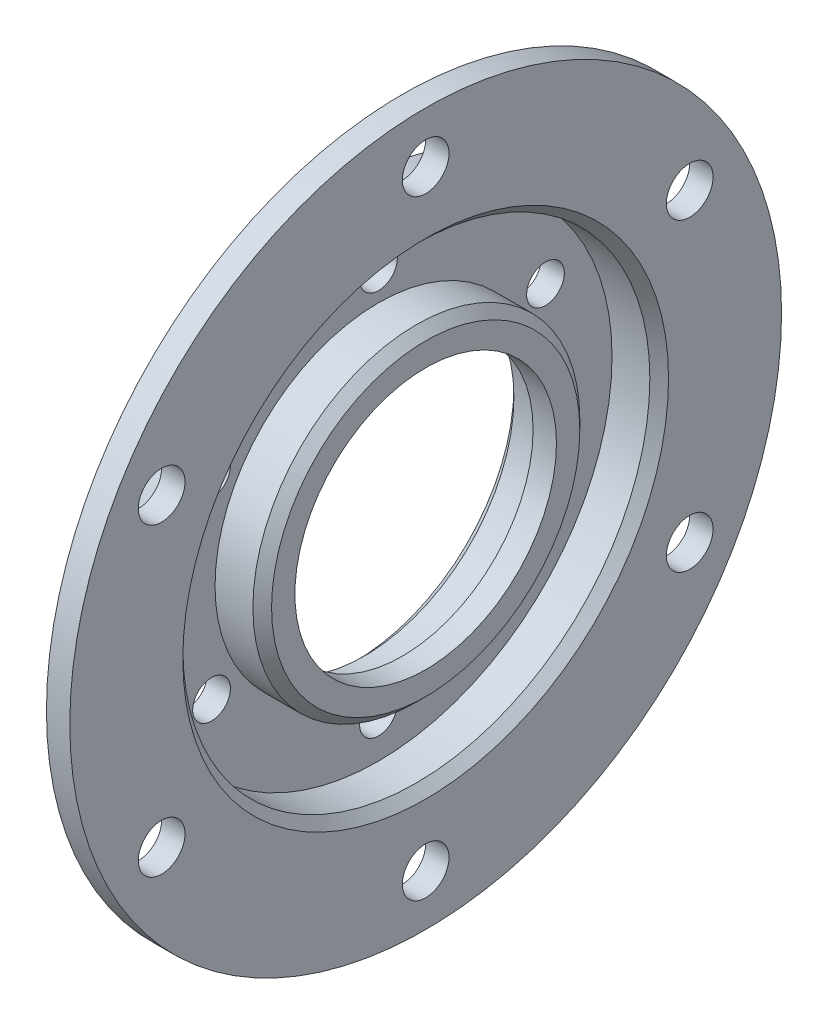
ISO-10303-21;
HEADER;
FILE_DESCRIPTION(('STEP AP214'),'2;1');
FILE_NAME('part.step','',(''),(''),'','','');
FILE_SCHEMA(('AUTOMOTIVE_DESIGN { 1 0 10303 214 1 1 1 1 }'));
ENDSEC;
DATA;
#1=APPLICATION_CONTEXT('core data for automotive mechanical design processes');
#2=APPLICATION_PROTOCOL_DEFINITION('international standard','automotive_design',2000,#1);
#3=PRODUCT_CONTEXT('',#1,'mechanical');
#4=PRODUCT('Part','Part','',(#3));
#5=PRODUCT_RELATED_PRODUCT_CATEGORY('part','',(#4));
#6=PRODUCT_DEFINITION_FORMATION('','',#4);
#7=PRODUCT_DEFINITION_CONTEXT('part definition',#1,'design');
#8=PRODUCT_DEFINITION('design','',#6,#7);
#9=PRODUCT_DEFINITION_SHAPE('','',#8);
#10=(LENGTH_UNIT() NAMED_UNIT(*) SI_UNIT(.MILLI.,.METRE.));
#11=(NAMED_UNIT(*) PLANE_ANGLE_UNIT() SI_UNIT($,.RADIAN.));
#12=(NAMED_UNIT(*) SI_UNIT($,.STERADIAN.) SOLID_ANGLE_UNIT());
#13=UNCERTAINTY_MEASURE_WITH_UNIT(LENGTH_MEASURE(1.E-05),#10,'distance_accuracy_value','');
#14=(GEOMETRIC_REPRESENTATION_CONTEXT(3) GLOBAL_UNCERTAINTY_ASSIGNED_CONTEXT((#13)) GLOBAL_UNIT_ASSIGNED_CONTEXT((#10,
#11,#12)) REPRESENTATION_CONTEXT('',''));
#15=CARTESIAN_POINT('',(0.,0.,0.));
#16=DIRECTION('',(0.,0.,1.));
#17=DIRECTION('',(1.,0.,0.));
#18=AXIS2_PLACEMENT_3D('',#15,#16,#17);
#19=CARTESIAN_POINT('',(5.05,20.64,0.));
#20=DIRECTION('',(-1.,0.,0.));
#21=DIRECTION('',(0.,0.,1.));
#22=AXIS2_PLACEMENT_3D('',#19,#20,#21);
#23=CYLINDRICAL_SURFACE('',#22,2.01929999999999);
#24=CARTESIAN_POINT('',(0.,20.64,0.));
#25=DIRECTION('',(1.,0.,0.));
#26=DIRECTION('',(0.,0.,-1.));
#27=AXIS2_PLACEMENT_3D('',#24,#25,#26);
#28=CIRCLE('',#27,2.01929999999999);
#29=CARTESIAN_POINT('',(0.,20.64,-2.01929999999999));
#30=VERTEX_POINT('',#29);
#31=EDGE_CURVE('E98',#30,#30,#28,.T.);
#32=ORIENTED_EDGE('',*,*,#31,.F.);
#33=EDGE_LOOP('',(#32));
#34=FACE_BOUND('',#33,.T.);
#35=CARTESIAN_POINT('',(2.5,20.64,0.));
#36=DIRECTION('',(1.,0.,0.));
#37=DIRECTION('',(0.,0.,-1.));
#38=AXIS2_PLACEMENT_3D('',#35,#36,#37);
#39=CIRCLE('',#38,2.01929999999999);
#40=CARTESIAN_POINT('',(2.5,20.64,-2.01929999999999));
#41=VERTEX_POINT('',#40);
#42=EDGE_CURVE('E187',#41,#41,#39,.T.);
#43=ORIENTED_EDGE('',*,*,#42,.T.);
#44=EDGE_LOOP('',(#43));
#45=FACE_BOUND('',#44,.T.);
#46=ADVANCED_FACE('F47',(#34,#45),#23,.F.);
#47=CARTESIAN_POINT('',(5.05,10.32,-17.8747643341108));
#48=DIRECTION('',(-1.,0.,0.));
#49=DIRECTION('',(0.,0.,1.));
#50=AXIS2_PLACEMENT_3D('',#47,#48,#49);
#51=CYLINDRICAL_SURFACE('',#50,2.01929999999999);
#52=CARTESIAN_POINT('',(0.,10.32,-17.8747643341108));
#53=DIRECTION('',(1.,0.,0.));
#54=DIRECTION('',(0.,0.,-1.));
#55=AXIS2_PLACEMENT_3D('',#52,#53,#54);
#56=CIRCLE('',#55,2.01929999999999);
#57=CARTESIAN_POINT('',(0.,10.32,-19.8940643341108));
#58=VERTEX_POINT('',#57);
#59=EDGE_CURVE('E102',#58,#58,#56,.T.);
#60=ORIENTED_EDGE('',*,*,#59,.F.);
#61=EDGE_LOOP('',(#60));
#62=FACE_BOUND('',#61,.T.);
#63=CARTESIAN_POINT('',(2.5,10.32,-17.8747643341108));
#64=DIRECTION('',(1.,0.,0.));
#65=DIRECTION('',(0.,0.,-1.));
#66=AXIS2_PLACEMENT_3D('',#63,#64,#65);
#67=CIRCLE('',#66,2.01929999999999);
#68=CARTESIAN_POINT('',(2.5,10.32,-19.8940643341108));
#69=VERTEX_POINT('',#68);
#70=EDGE_CURVE('E194',#69,#69,#67,.T.);
#71=ORIENTED_EDGE('',*,*,#70,.T.);
#72=EDGE_LOOP('',(#71));
#73=FACE_BOUND('',#72,.T.);
#74=ADVANCED_FACE('F239',(#62,#73),#51,.F.);
#75=CARTESIAN_POINT('',(5.05,-10.3200000000001,-17.8747643341108));
#76=DIRECTION('',(-1.,0.,0.));
#77=DIRECTION('',(0.,0.,1.));
#78=AXIS2_PLACEMENT_3D('',#75,#76,#77);
#79=CYLINDRICAL_SURFACE('',#78,2.01929999999999);
#80=CARTESIAN_POINT('',(0.,-10.3200000000001,-17.8747643341108));
#81=DIRECTION('',(1.,0.,0.));
#82=DIRECTION('',(0.,0.,-1.));
#83=AXIS2_PLACEMENT_3D('',#80,#81,#82);
#84=CIRCLE('',#83,2.01929999999999);
#85=CARTESIAN_POINT('',(0.,-10.3200000000001,-19.8940643341108));
#86=VERTEX_POINT('',#85);
#87=EDGE_CURVE('E112',#86,#86,#84,.T.);
#88=ORIENTED_EDGE('',*,*,#87,.F.);
#89=EDGE_LOOP('',(#88));
#90=FACE_BOUND('',#89,.T.);
#91=CARTESIAN_POINT('',(2.5,-10.3200000000001,-17.8747643341108));
#92=DIRECTION('',(1.,0.,0.));
#93=DIRECTION('',(0.,0.,-1.));
#94=AXIS2_PLACEMENT_3D('',#91,#92,#93);
#95=CIRCLE('',#94,2.01929999999999);
#96=CARTESIAN_POINT('',(2.5,-10.3200000000001,-19.8940643341108));
#97=VERTEX_POINT('',#96);
#98=EDGE_CURVE('E198',#97,#97,#95,.T.);
#99=ORIENTED_EDGE('',*,*,#98,.T.);
#100=EDGE_LOOP('',(#99));
#101=FACE_BOUND('',#100,.T.);
#102=ADVANCED_FACE('F246',(#90,#101),#79,.F.);
#103=CARTESIAN_POINT('',(5.05,-20.64,1.44128349667445E-13));
#104=DIRECTION('',(-1.,0.,0.));
#105=DIRECTION('',(0.,0.,1.));
#106=AXIS2_PLACEMENT_3D('',#103,#104,#105);
#107=CYLINDRICAL_SURFACE('',#106,2.01929999999999);
#108=CARTESIAN_POINT('',(0.,-20.64,1.44128349667445E-13));
#109=DIRECTION('',(1.,0.,0.));
#110=DIRECTION('',(0.,0.,-1.));
#111=AXIS2_PLACEMENT_3D('',#108,#109,#110);
#112=CIRCLE('',#111,2.01929999999999);
#113=CARTESIAN_POINT('',(0.,-20.64,-2.01929999999985));
#114=VERTEX_POINT('',#113);
#115=EDGE_CURVE('E116',#114,#114,#112,.T.);
#116=ORIENTED_EDGE('',*,*,#115,.F.);
#117=EDGE_LOOP('',(#116));
#118=FACE_BOUND('',#117,.T.);
#119=CARTESIAN_POINT('',(2.5,-20.64,1.44128349667445E-13));
#120=DIRECTION('',(1.,0.,0.));
#121=DIRECTION('',(0.,0.,-1.));
#122=AXIS2_PLACEMENT_3D('',#119,#120,#121);
#123=CIRCLE('',#122,2.01929999999999);
#124=CARTESIAN_POINT('',(2.5,-20.64,-2.01929999999985));
#125=VERTEX_POINT('',#124);
#126=EDGE_CURVE('E202',#125,#125,#123,.T.);
#127=ORIENTED_EDGE('',*,*,#126,.T.);
#128=EDGE_LOOP('',(#127));
#129=FACE_BOUND('',#128,.T.);
#130=ADVANCED_FACE('F314',(#118,#129),#107,.F.);
#131=CARTESIAN_POINT('',(5.05,-10.3199999999998,17.8747643341109));
#132=DIRECTION('',(-1.,0.,0.));
#133=DIRECTION('',(0.,0.,1.));
#134=AXIS2_PLACEMENT_3D('',#131,#132,#133);
#135=CYLINDRICAL_SURFACE('',#134,2.01929999999999);
#136=CARTESIAN_POINT('',(0.,-10.3199999999998,17.8747643341109));
#137=DIRECTION('',(1.,0.,0.));
#138=DIRECTION('',(0.,0.,-1.));
#139=AXIS2_PLACEMENT_3D('',#136,#137,#138);
#140=CIRCLE('',#139,2.01929999999999);
#141=CARTESIAN_POINT('',(0.,-10.3199999999998,15.8554643341109));
#142=VERTEX_POINT('',#141);
#143=EDGE_CURVE('E120',#142,#142,#140,.T.);
#144=ORIENTED_EDGE('',*,*,#143,.F.);
#145=EDGE_LOOP('',(#144));
#146=FACE_BOUND('',#145,.T.);
#147=CARTESIAN_POINT('',(2.5,-10.3199999999998,17.8747643341109));
#148=DIRECTION('',(1.,0.,0.));
#149=DIRECTION('',(0.,0.,-1.));
#150=AXIS2_PLACEMENT_3D('',#147,#148,#149);
#151=CIRCLE('',#150,2.01929999999999);
#152=CARTESIAN_POINT('',(2.5,-10.3199999999998,15.8554643341109));
#153=VERTEX_POINT('',#152);
#154=EDGE_CURVE('E93',#153,#153,#151,.T.);
#155=ORIENTED_EDGE('',*,*,#154,.T.);
#156=EDGE_LOOP('',(#155));
#157=FACE_BOUND('',#156,.T.);
#158=ADVANCED_FACE('F303',(#146,#157),#135,.F.);
#159=CARTESIAN_POINT('',(5.05,10.3200000000002,17.8747643341107));
#160=DIRECTION('',(-1.,0.,0.));
#161=DIRECTION('',(0.,0.,1.));
#162=AXIS2_PLACEMENT_3D('',#159,#160,#161);
#163=CYLINDRICAL_SURFACE('',#162,2.01929999999999);
#164=CARTESIAN_POINT('',(0.,10.3200000000002,17.8747643341107));
#165=DIRECTION('',(1.,0.,0.));
#166=DIRECTION('',(0.,0.,-1.));
#167=AXIS2_PLACEMENT_3D('',#164,#165,#166);
#168=CIRCLE('',#167,2.01929999999999);
#169=CARTESIAN_POINT('',(0.,10.3200000000002,15.8554643341107));
#170=VERTEX_POINT('',#169);
#171=EDGE_CURVE('E107',#170,#170,#168,.T.);
#172=ORIENTED_EDGE('',*,*,#171,.F.);
#173=EDGE_LOOP('',(#172));
#174=FACE_BOUND('',#173,.T.);
#175=CARTESIAN_POINT('',(2.5,10.3200000000002,17.8747643341107));
#176=DIRECTION('',(1.,0.,0.));
#177=DIRECTION('',(0.,0.,-1.));
#178=AXIS2_PLACEMENT_3D('',#175,#176,#177);
#179=CIRCLE('',#178,2.01929999999999);
#180=CARTESIAN_POINT('',(2.5,10.3200000000002,15.8554643341107));
#181=VERTEX_POINT('',#180);
#182=EDGE_CURVE('E89',#181,#181,#179,.T.);
#183=ORIENTED_EDGE('',*,*,#182,.T.);
#184=EDGE_LOOP('',(#183));
#185=FACE_BOUND('',#184,.T.);
#186=ADVANCED_FACE('F300',(#174,#185),#163,.F.);
#187=CARTESIAN_POINT('',(7.55,0.,0.));
#188=DIRECTION('',(1.,0.,0.));
#189=DIRECTION('',(0.,0.,-1.));
#190=AXIS2_PLACEMENT_3D('',#187,#188,#189);
#191=PLANE('',#190);
#192=CARTESIAN_POINT('',(7.55,0.,0.));
#193=DIRECTION('',(1.,0.,0.));
#194=DIRECTION('',(0.,0.,-1.));
#195=AXIS2_PLACEMENT_3D('',#192,#193,#194);
#196=CIRCLE('',#195,16.5);
#197=CARTESIAN_POINT('',(7.55,0.,-16.5));
#198=VERTEX_POINT('',#197);
#199=EDGE_CURVE('E84',#198,#198,#196,.T.);
#200=ORIENTED_EDGE('',*,*,#199,.T.);
#201=EDGE_LOOP('',(#200));
#202=FACE_BOUND('',#201,.T.);
#203=CARTESIAN_POINT('',(7.55,0.,0.));
#204=DIRECTION('',(1.,0.,0.));
#205=DIRECTION('',(0.,0.,-1.));
#206=AXIS2_PLACEMENT_3D('',#203,#204,#205);
#207=CIRCLE('',#206,14.);
#208=CARTESIAN_POINT('',(7.55,0.,-14.));
#209=VERTEX_POINT('',#208);
#210=EDGE_CURVE('E131',#209,#209,#207,.T.);
#211=ORIENTED_EDGE('',*,*,#210,.F.);
#212=EDGE_LOOP('',(#211));
#213=FACE_BOUND('',#212,.T.);
#214=ADVANCED_FACE('F258',(#202,#213),#191,.T.);
#215=CARTESIAN_POINT('',(0.,0.,0.));
#216=DIRECTION('',(1.,0.,0.));
#217=DIRECTION('',(0.,0.,-1.));
#218=AXIS2_PLACEMENT_3D('',#215,#216,#217);
#219=PLANE('',#218);
#220=CARTESIAN_POINT('',(0.,0.,0.));
#221=DIRECTION('',(1.,0.,0.));
#222=DIRECTION('',(0.,0.,-1.));
#223=AXIS2_PLACEMENT_3D('',#220,#221,#222);
#224=CIRCLE('',#223,17.);
#225=CARTESIAN_POINT('',(0.,0.,-17.));
#226=VERTEX_POINT('',#225);
#227=EDGE_CURVE('E66',#226,#226,#224,.T.);
#228=ORIENTED_EDGE('',*,*,#227,.T.);
#229=EDGE_LOOP('',(#228));
#230=FACE_BOUND('',#229,.T.);
#231=CARTESIAN_POINT('',(0.,0.,0.));
#232=DIRECTION('',(1.,0.,0.));
#233=DIRECTION('',(0.,0.,-1.));
#234=AXIS2_PLACEMENT_3D('',#231,#232,#233);
#235=CIRCLE('',#234,27.5);
#236=CARTESIAN_POINT('',(0.,0.,-27.5));
#237=VERTEX_POINT('',#236);
#238=EDGE_CURVE('E88',#237,#237,#235,.T.);
#239=ORIENTED_EDGE('',*,*,#238,.F.);
#240=EDGE_LOOP('',(#239));
#241=FACE_BOUND('',#240,.T.);
#242=ORIENTED_EDGE('',*,*,#31,.T.);
#243=EDGE_LOOP('',(#242));
#244=FACE_BOUND('',#243,.T.);
#245=ORIENTED_EDGE('',*,*,#59,.T.);
#246=EDGE_LOOP('',(#245));
#247=FACE_BOUND('',#246,.T.);
#248=ORIENTED_EDGE('',*,*,#87,.T.);
#249=EDGE_LOOP('',(#248));
#250=FACE_BOUND('',#249,.T.);
#251=ORIENTED_EDGE('',*,*,#115,.T.);
#252=EDGE_LOOP('',(#251));
#253=FACE_BOUND('',#252,.T.);
#254=ORIENTED_EDGE('',*,*,#143,.T.);
#255=EDGE_LOOP('',(#254));
#256=FACE_BOUND('',#255,.T.);
#257=ORIENTED_EDGE('',*,*,#171,.T.);
#258=EDGE_LOOP('',(#257));
#259=FACE_BOUND('',#258,.T.);
#260=ADVANCED_FACE('F254',(#230,#241,#244,#247,#250,#253,#256,#259),#219,.F.);
#261=CARTESIAN_POINT('',(5.05,0.,0.));
#262=DIRECTION('',(-1.,0.,0.));
#263=DIRECTION('',(0.,0.,1.));
#264=AXIS2_PLACEMENT_3D('',#261,#262,#263);
#265=CYLINDRICAL_SURFACE('',#264,27.5);
#266=CARTESIAN_POINT('',(4.05000000000001,0.,0.));
#267=DIRECTION('',(1.,0.,0.));
#268=DIRECTION('',(0.,0.,-1.));
#269=AXIS2_PLACEMENT_3D('',#266,#267,#268);
#270=CIRCLE('',#269,27.5);
#271=CARTESIAN_POINT('',(4.05000000000001,0.,-27.5));
#272=VERTEX_POINT('',#271);
#273=EDGE_CURVE('E11',#272,#272,#270,.F.);
#274=ORIENTED_EDGE('',*,*,#273,.T.);
#275=EDGE_LOOP('',(#274));
#276=FACE_BOUND('',#275,.T.);
#277=ORIENTED_EDGE('',*,*,#238,.T.);
#278=EDGE_LOOP('',(#277));
#279=FACE_BOUND('',#278,.T.);
#280=ADVANCED_FACE('F257',(#276,#279),#265,.T.);
#281=CARTESIAN_POINT('',(5.05,0.,0.));
#282=DIRECTION('',(-1.,0.,0.));
#283=DIRECTION('',(0.,0.,1.));
#284=AXIS2_PLACEMENT_3D('',#281,#282,#283);
#285=CYLINDRICAL_SURFACE('',#284,16.);
#286=CARTESIAN_POINT('',(1.,0.,0.));
#287=DIRECTION('',(1.,0.,0.));
#288=DIRECTION('',(0.,0.,-1.));
#289=AXIS2_PLACEMENT_3D('',#286,#287,#288);
#290=CIRCLE('',#289,16.);
#291=CARTESIAN_POINT('',(1.,0.,-16.));
#292=VERTEX_POINT('',#291);
#293=EDGE_CURVE('E61',#292,#292,#290,.F.);
#294=ORIENTED_EDGE('',*,*,#293,.T.);
#295=EDGE_LOOP('',(#294));
#296=FACE_BOUND('',#295,.T.);
#297=CARTESIAN_POINT('',(5.05,0.,0.));
#298=DIRECTION('',(1.,0.,0.));
#299=DIRECTION('',(0.,0.,-1.));
#300=AXIS2_PLACEMENT_3D('',#297,#298,#299);
#301=CIRCLE('',#300,16.);
#302=CARTESIAN_POINT('',(5.05,0.,-16.));
#303=VERTEX_POINT('',#302);
#304=EDGE_CURVE('E103',#303,#303,#301,.T.);
#305=ORIENTED_EDGE('',*,*,#304,.T.);
#306=EDGE_LOOP('',(#305));
#307=FACE_BOUND('',#306,.T.);
#308=ADVANCED_FACE('F253',(#296,#307),#285,.F.);
#309=CARTESIAN_POINT('',(5.05,0.,0.));
#310=DIRECTION('',(1.,0.,0.));
#311=DIRECTION('',(0.,0.,-1.));
#312=AXIS2_PLACEMENT_3D('',#309,#310,#311);
#313=PLANE('',#312);
#314=CARTESIAN_POINT('',(5.05,0.,0.));
#315=DIRECTION('',(1.,0.,0.));
#316=DIRECTION('',(0.,0.,-1.));
#317=AXIS2_PLACEMENT_3D('',#314,#315,#316);
#318=CIRCLE('',#317,14.);
#319=CARTESIAN_POINT('',(5.05,0.,-14.));
#320=VERTEX_POINT('',#319);
#321=EDGE_CURVE('E135',#320,#320,#318,.T.);
#322=ORIENTED_EDGE('',*,*,#321,.T.);
#323=EDGE_LOOP('',(#322));
#324=FACE_BOUND('',#323,.T.);
#325=ORIENTED_EDGE('',*,*,#304,.F.);
#326=EDGE_LOOP('',(#325));
#327=FACE_BOUND('',#326,.T.);
#328=ADVANCED_FACE('F438',(#324,#327),#313,.F.);
#329=CARTESIAN_POINT('',(7.55,0.,0.));
#330=DIRECTION('',(1.,0.,0.));
#331=DIRECTION('',(0.,0.,-1.));
#332=AXIS2_PLACEMENT_3D('',#329,#330,#331);
#333=CIRCLE('',#332,26.);
#334=CARTESIAN_POINT('',(7.55,0.,-26.));
#335=VERTEX_POINT('',#334);
#336=EDGE_CURVE('E72',#335,#335,#333,.F.);
#337=ORIENTED_EDGE('',*,*,#336,.T.);
#338=EDGE_LOOP('',(#337));
#339=FACE_BOUND('',#338,.T.);
#340=CARTESIAN_POINT('',(7.55,-16.3199999999997,28.2670691795242));
#341=DIRECTION('',(1.,0.,0.));
#342=DIRECTION('',(0.,0.,-1.));
#343=AXIS2_PLACEMENT_3D('',#340,#341,#342);
#344=CIRCLE('',#343,2.5);
#345=CARTESIAN_POINT('',(7.55,-16.3199999999997,25.7670691795242));
#346=VERTEX_POINT('',#345);
#347=EDGE_CURVE('E171',#346,#346,#344,.T.);
#348=ORIENTED_EDGE('',*,*,#347,.F.);
#349=EDGE_LOOP('',(#348));
#350=FACE_BOUND('',#349,.T.);
#351=CARTESIAN_POINT('',(7.55,-16.3200000000001,-28.267069179524));
#352=DIRECTION('',(1.,0.,0.));
#353=DIRECTION('',(0.,0.,-1.));
#354=AXIS2_PLACEMENT_3D('',#351,#352,#353);
#355=CIRCLE('',#354,2.5);
#356=CARTESIAN_POINT('',(7.55,-16.3200000000001,-30.767069179524));
#357=VERTEX_POINT('',#356);
#358=EDGE_CURVE('E155',#357,#357,#355,.T.);
#359=ORIENTED_EDGE('',*,*,#358,.F.);
#360=EDGE_LOOP('',(#359));
#361=FACE_BOUND('',#360,.T.);
#362=CARTESIAN_POINT('',(7.55,0.,0.));
#363=DIRECTION('',(1.,0.,0.));
#364=DIRECTION('',(0.,0.,-1.));
#365=AXIS2_PLACEMENT_3D('',#362,#363,#364);
#366=CIRCLE('',#365,38.1);
#367=CARTESIAN_POINT('',(7.55,0.,-38.1));
#368=VERTEX_POINT('',#367);
#369=EDGE_CURVE('E108',#368,#368,#366,.T.);
#370=ORIENTED_EDGE('',*,*,#369,.T.);
#371=EDGE_LOOP('',(#370));
#372=FACE_BOUND('',#371,.T.);
#373=CARTESIAN_POINT('',(7.55,32.64,0.));
#374=DIRECTION('',(1.,0.,0.));
#375=DIRECTION('',(0.,0.,-1.));
#376=AXIS2_PLACEMENT_3D('',#373,#374,#375);
#377=CIRCLE('',#376,2.5);
#378=CARTESIAN_POINT('',(7.55,32.64,-2.5));
#379=VERTEX_POINT('',#378);
#380=EDGE_CURVE('E139',#379,#379,#377,.T.);
#381=ORIENTED_EDGE('',*,*,#380,.F.);
#382=EDGE_LOOP('',(#381));
#383=FACE_BOUND('',#382,.T.);
#384=CARTESIAN_POINT('',(7.55,16.3199999999999,-28.2670691795241));
#385=DIRECTION('',(1.,0.,0.));
#386=DIRECTION('',(0.,0.,-1.));
#387=AXIS2_PLACEMENT_3D('',#384,#385,#386);
#388=CIRCLE('',#387,2.5);
#389=CARTESIAN_POINT('',(7.55,16.3199999999999,-30.7670691795241));
#390=VERTEX_POINT('',#389);
#391=EDGE_CURVE('E147',#390,#390,#388,.T.);
#392=ORIENTED_EDGE('',*,*,#391,.F.);
#393=EDGE_LOOP('',(#392));
#394=FACE_BOUND('',#393,.T.);
#395=CARTESIAN_POINT('',(7.55,-32.64,2.2792390179968E-13));
#396=DIRECTION('',(1.,0.,0.));
#397=DIRECTION('',(0.,0.,-1.));
#398=AXIS2_PLACEMENT_3D('',#395,#396,#397);
#399=CIRCLE('',#398,2.5);
#400=CARTESIAN_POINT('',(7.55,-32.64,-2.49999999999977));
#401=VERTEX_POINT('',#400);
#402=EDGE_CURVE('E163',#401,#401,#399,.T.);
#403=ORIENTED_EDGE('',*,*,#402,.F.);
#404=EDGE_LOOP('',(#403));
#405=FACE_BOUND('',#404,.T.);
#406=CARTESIAN_POINT('',(7.55,16.3200000000003,28.2670691795239));
#407=DIRECTION('',(1.,0.,0.));
#408=DIRECTION('',(0.,0.,-1.));
#409=AXIS2_PLACEMENT_3D('',#406,#407,#408);
#410=CIRCLE('',#409,2.5);
#411=CARTESIAN_POINT('',(7.55,16.3200000000003,25.7670691795239));
#412=VERTEX_POINT('',#411);
#413=EDGE_CURVE('E179',#412,#412,#410,.T.);
#414=ORIENTED_EDGE('',*,*,#413,.F.);
#415=EDGE_LOOP('',(#414));
#416=FACE_BOUND('',#415,.T.);
#417=ADVANCED_FACE('F313',(#339,#350,#361,#372,#383,#394,#405,#416),#191,.T.);
#418=CARTESIAN_POINT('',(5.05,0.,0.));
#419=DIRECTION('',(1.,0.,0.));
#420=DIRECTION('',(0.,0.,-1.));
#421=AXIS2_PLACEMENT_3D('',#418,#419,#420);
#422=CIRCLE('',#421,28.5);
#423=CARTESIAN_POINT('',(5.05,0.,-28.5));
#424=VERTEX_POINT('',#423);
#425=EDGE_CURVE('E56',#424,#424,#422,.T.);
#426=ORIENTED_EDGE('',*,*,#425,.T.);
#427=EDGE_LOOP('',(#426));
#428=FACE_BOUND('',#427,.T.);
#429=CARTESIAN_POINT('',(5.05,0.,0.));
#430=DIRECTION('',(1.,0.,0.));
#431=DIRECTION('',(0.,0.,-1.));
#432=AXIS2_PLACEMENT_3D('',#429,#430,#431);
#433=CIRCLE('',#432,38.1);
#434=CARTESIAN_POINT('',(5.05,0.,-38.1));
#435=VERTEX_POINT('',#434);
#436=EDGE_CURVE('E127',#435,#435,#433,.T.);
#437=ORIENTED_EDGE('',*,*,#436,.F.);
#438=EDGE_LOOP('',(#437));
#439=FACE_BOUND('',#438,.T.);
#440=CARTESIAN_POINT('',(5.05,32.64,0.));
#441=DIRECTION('',(1.,0.,0.));
#442=DIRECTION('',(0.,0.,-1.));
#443=AXIS2_PLACEMENT_3D('',#440,#441,#442);
#444=CIRCLE('',#443,2.5);
#445=CARTESIAN_POINT('',(5.05,32.64,-2.5));
#446=VERTEX_POINT('',#445);
#447=EDGE_CURVE('E143',#446,#446,#444,.T.);
#448=ORIENTED_EDGE('',*,*,#447,.T.);
#449=EDGE_LOOP('',(#448));
#450=FACE_BOUND('',#449,.T.);
#451=CARTESIAN_POINT('',(5.05,16.3199999999999,-28.2670691795241));
#452=DIRECTION('',(1.,0.,0.));
#453=DIRECTION('',(0.,0.,-1.));
#454=AXIS2_PLACEMENT_3D('',#451,#452,#453);
#455=CIRCLE('',#454,2.5);
#456=CARTESIAN_POINT('',(5.05,16.3199999999999,-30.7670691795241));
#457=VERTEX_POINT('',#456);
#458=EDGE_CURVE('E151',#457,#457,#455,.T.);
#459=ORIENTED_EDGE('',*,*,#458,.T.);
#460=EDGE_LOOP('',(#459));
#461=FACE_BOUND('',#460,.T.);
#462=CARTESIAN_POINT('',(5.05,-16.3200000000001,-28.267069179524));
#463=DIRECTION('',(1.,0.,0.));
#464=DIRECTION('',(0.,0.,-1.));
#465=AXIS2_PLACEMENT_3D('',#462,#463,#464);
#466=CIRCLE('',#465,2.5);
#467=CARTESIAN_POINT('',(5.05,-16.3200000000001,-30.767069179524));
#468=VERTEX_POINT('',#467);
#469=EDGE_CURVE('E159',#468,#468,#466,.T.);
#470=ORIENTED_EDGE('',*,*,#469,.T.);
#471=EDGE_LOOP('',(#470));
#472=FACE_BOUND('',#471,.T.);
#473=CARTESIAN_POINT('',(5.05,-32.64,2.2792390179968E-13));
#474=DIRECTION('',(1.,0.,0.));
#475=DIRECTION('',(0.,0.,-1.));
#476=AXIS2_PLACEMENT_3D('',#473,#474,#475);
#477=CIRCLE('',#476,2.5);
#478=CARTESIAN_POINT('',(5.05,-32.64,-2.49999999999977));
#479=VERTEX_POINT('',#478);
#480=EDGE_CURVE('E167',#479,#479,#477,.T.);
#481=ORIENTED_EDGE('',*,*,#480,.T.);
#482=EDGE_LOOP('',(#481));
#483=FACE_BOUND('',#482,.T.);
#484=CARTESIAN_POINT('',(5.05,-16.3199999999997,28.2670691795242));
#485=DIRECTION('',(1.,0.,0.));
#486=DIRECTION('',(0.,0.,-1.));
#487=AXIS2_PLACEMENT_3D('',#484,#485,#486);
#488=CIRCLE('',#487,2.5);
#489=CARTESIAN_POINT('',(5.05,-16.3199999999997,25.7670691795242));
#490=VERTEX_POINT('',#489);
#491=EDGE_CURVE('E175',#490,#490,#488,.T.);
#492=ORIENTED_EDGE('',*,*,#491,.T.);
#493=EDGE_LOOP('',(#492));
#494=FACE_BOUND('',#493,.T.);
#495=CARTESIAN_POINT('',(5.05,16.3200000000003,28.2670691795239));
#496=DIRECTION('',(1.,0.,0.));
#497=DIRECTION('',(0.,0.,-1.));
#498=AXIS2_PLACEMENT_3D('',#495,#496,#497);
#499=CIRCLE('',#498,2.5);
#500=CARTESIAN_POINT('',(5.05,16.3200000000003,25.7670691795239));
#501=VERTEX_POINT('',#500);
#502=EDGE_CURVE('E183',#501,#501,#499,.T.);
#503=ORIENTED_EDGE('',*,*,#502,.T.);
#504=EDGE_LOOP('',(#503));
#505=FACE_BOUND('',#504,.T.);
#506=ADVANCED_FACE('F430',(#428,#439,#450,#461,#472,#483,#494,#505),#313,.F.);
#507=CARTESIAN_POINT('',(7.55,0.,0.));
#508=DIRECTION('',(-1.,0.,0.));
#509=DIRECTION('',(0.,0.,1.));
#510=AXIS2_PLACEMENT_3D('',#507,#508,#509);
#511=CYLINDRICAL_SURFACE('',#510,38.1);
#512=ORIENTED_EDGE('',*,*,#369,.F.);
#513=EDGE_LOOP('',(#512));
#514=FACE_BOUND('',#513,.T.);
#515=ORIENTED_EDGE('',*,*,#436,.T.);
#516=EDGE_LOOP('',(#515));
#517=FACE_BOUND('',#516,.T.);
#518=ADVANCED_FACE('F318',(#514,#517),#511,.T.);
#519=CARTESIAN_POINT('',(7.55,0.,0.));
#520=DIRECTION('',(-1.,0.,0.));
#521=DIRECTION('',(0.,0.,1.));
#522=AXIS2_PLACEMENT_3D('',#519,#520,#521);
#523=CYLINDRICAL_SURFACE('',#522,14.);
#524=ORIENTED_EDGE('',*,*,#210,.T.);
#525=EDGE_LOOP('',(#524));
#526=FACE_BOUND('',#525,.T.);
#527=ORIENTED_EDGE('',*,*,#321,.F.);
#528=EDGE_LOOP('',(#527));
#529=FACE_BOUND('',#528,.T.);
#530=ADVANCED_FACE('F413',(#526,#529),#523,.F.);
#531=CARTESIAN_POINT('',(7.55,32.64,0.));
#532=DIRECTION('',(-1.,0.,0.));
#533=DIRECTION('',(0.,0.,1.));
#534=AXIS2_PLACEMENT_3D('',#531,#532,#533);
#535=CYLINDRICAL_SURFACE('',#534,2.5);
#536=ORIENTED_EDGE('',*,*,#380,.T.);
#537=EDGE_LOOP('',(#536));
#538=FACE_BOUND('',#537,.T.);
#539=ORIENTED_EDGE('',*,*,#447,.F.);
#540=EDGE_LOOP('',(#539));
#541=FACE_BOUND('',#540,.T.);
#542=ADVANCED_FACE('F404',(#538,#541),#535,.F.);
#543=CARTESIAN_POINT('',(7.55,16.3199999999999,-28.2670691795241));
#544=DIRECTION('',(-1.,0.,0.));
#545=DIRECTION('',(0.,0.,1.));
#546=AXIS2_PLACEMENT_3D('',#543,#544,#545);
#547=CYLINDRICAL_SURFACE('',#546,2.5);
#548=ORIENTED_EDGE('',*,*,#391,.T.);
#549=EDGE_LOOP('',(#548));
#550=FACE_BOUND('',#549,.T.);
#551=ORIENTED_EDGE('',*,*,#458,.F.);
#552=EDGE_LOOP('',(#551));
#553=FACE_BOUND('',#552,.T.);
#554=ADVANCED_FACE('F395',(#550,#553),#547,.F.);
#555=CARTESIAN_POINT('',(7.55,-16.3200000000001,-28.267069179524));
#556=DIRECTION('',(-1.,0.,0.));
#557=DIRECTION('',(0.,0.,1.));
#558=AXIS2_PLACEMENT_3D('',#555,#556,#557);
#559=CYLINDRICAL_SURFACE('',#558,2.5);
#560=ORIENTED_EDGE('',*,*,#358,.T.);
#561=EDGE_LOOP('',(#560));
#562=FACE_BOUND('',#561,.T.);
#563=ORIENTED_EDGE('',*,*,#469,.F.);
#564=EDGE_LOOP('',(#563));
#565=FACE_BOUND('',#564,.T.);
#566=ADVANCED_FACE('F386',(#562,#565),#559,.F.);
#567=CARTESIAN_POINT('',(7.55,-32.64,2.2792390179968E-13));
#568=DIRECTION('',(-1.,0.,0.));
#569=DIRECTION('',(0.,0.,1.));
#570=AXIS2_PLACEMENT_3D('',#567,#568,#569);
#571=CYLINDRICAL_SURFACE('',#570,2.5);
#572=ORIENTED_EDGE('',*,*,#402,.T.);
#573=EDGE_LOOP('',(#572));
#574=FACE_BOUND('',#573,.T.);
#575=ORIENTED_EDGE('',*,*,#480,.F.);
#576=EDGE_LOOP('',(#575));
#577=FACE_BOUND('',#576,.T.);
#578=ADVANCED_FACE('F377',(#574,#577),#571,.F.);
#579=CARTESIAN_POINT('',(7.55,-16.3199999999997,28.2670691795242));
#580=DIRECTION('',(-1.,0.,0.));
#581=DIRECTION('',(0.,0.,1.));
#582=AXIS2_PLACEMENT_3D('',#579,#580,#581);
#583=CYLINDRICAL_SURFACE('',#582,2.5);
#584=ORIENTED_EDGE('',*,*,#347,.T.);
#585=EDGE_LOOP('',(#584));
#586=FACE_BOUND('',#585,.T.);
#587=ORIENTED_EDGE('',*,*,#491,.F.);
#588=EDGE_LOOP('',(#587));
#589=FACE_BOUND('',#588,.T.);
#590=ADVANCED_FACE('F368',(#586,#589),#583,.F.);
#591=CARTESIAN_POINT('',(7.55,16.3200000000003,28.2670691795239));
#592=DIRECTION('',(-1.,0.,0.));
#593=DIRECTION('',(0.,0.,1.));
#594=AXIS2_PLACEMENT_3D('',#591,#592,#593);
#595=CYLINDRICAL_SURFACE('',#594,2.5);
#596=ORIENTED_EDGE('',*,*,#413,.T.);
#597=EDGE_LOOP('',(#596));
#598=FACE_BOUND('',#597,.T.);
#599=ORIENTED_EDGE('',*,*,#502,.F.);
#600=EDGE_LOOP('',(#599));
#601=FACE_BOUND('',#600,.T.);
#602=ADVANCED_FACE('F235',(#598,#601),#595,.F.);
#603=CARTESIAN_POINT('',(-70.7106781186548,0.,0.));
#604=DIRECTION('',(1.,0.,0.));
#605=DIRECTION('',(0.,0.,-1.));
#606=AXIS2_PLACEMENT_3D('',#603,#604,#605);
#607=CYLINDRICAL_SURFACE('',#606,25.);
#608=CARTESIAN_POINT('',(6.55000000000001,0.,0.));
#609=DIRECTION('',(1.,0.,0.));
#610=DIRECTION('',(0.,0.,-1.));
#611=AXIS2_PLACEMENT_3D('',#608,#609,#610);
#612=CIRCLE('',#611,25.);
#613=CARTESIAN_POINT('',(6.55000000000001,0.,-25.));
#614=VERTEX_POINT('',#613);
#615=EDGE_CURVE('E76',#614,#614,#612,.T.);
#616=ORIENTED_EDGE('',*,*,#615,.T.);
#617=EDGE_LOOP('',(#616));
#618=FACE_BOUND('',#617,.T.);
#619=CARTESIAN_POINT('',(2.5,0.,0.));
#620=DIRECTION('',(1.,0.,0.));
#621=DIRECTION('',(0.,0.,-1.));
#622=AXIS2_PLACEMENT_3D('',#619,#620,#621);
#623=CIRCLE('',#622,25.);
#624=CARTESIAN_POINT('',(2.5,0.,-25.));
#625=VERTEX_POINT('',#624);
#626=EDGE_CURVE('E212',#625,#625,#623,.F.);
#627=ORIENTED_EDGE('',*,*,#626,.T.);
#628=EDGE_LOOP('',(#627));
#629=FACE_BOUND('',#628,.T.);
#630=ADVANCED_FACE('F217',(#618,#629),#607,.F.);
#631=CARTESIAN_POINT('',(-70.7106781186548,0.,0.));
#632=DIRECTION('',(1.,0.,0.));
#633=DIRECTION('',(0.,0.,-1.));
#634=AXIS2_PLACEMENT_3D('',#631,#632,#633);
#635=CYLINDRICAL_SURFACE('',#634,17.5);
#636=CARTESIAN_POINT('',(6.54999999999999,0.,0.));
#637=DIRECTION('',(1.,0.,0.));
#638=DIRECTION('',(0.,0.,-1.));
#639=AXIS2_PLACEMENT_3D('',#636,#637,#638);
#640=CIRCLE('',#639,17.5);
#641=CARTESIAN_POINT('',(6.54999999999999,0.,-17.5));
#642=VERTEX_POINT('',#641);
#643=EDGE_CURVE('E80',#642,#642,#640,.F.);
#644=ORIENTED_EDGE('',*,*,#643,.T.);
#645=EDGE_LOOP('',(#644));
#646=FACE_BOUND('',#645,.T.);
#647=CARTESIAN_POINT('',(2.5,0.,0.));
#648=DIRECTION('',(1.,0.,0.));
#649=DIRECTION('',(0.,0.,-1.));
#650=AXIS2_PLACEMENT_3D('',#647,#648,#649);
#651=CIRCLE('',#650,17.5);
#652=CARTESIAN_POINT('',(2.5,0.,-17.5));
#653=VERTEX_POINT('',#652);
#654=EDGE_CURVE('E94',#653,#653,#651,.F.);
#655=ORIENTED_EDGE('',*,*,#654,.F.);
#656=EDGE_LOOP('',(#655));
#657=FACE_BOUND('',#656,.T.);
#658=ADVANCED_FACE('F223',(#646,#657),#635,.T.);
#659=CARTESIAN_POINT('',(2.5,0.,0.));
#660=DIRECTION('',(1.,0.,0.));
#661=DIRECTION('',(0.,0.,-1.));
#662=AXIS2_PLACEMENT_3D('',#659,#660,#661);
#663=PLANE('',#662);
#664=ORIENTED_EDGE('',*,*,#42,.F.);
#665=EDGE_LOOP('',(#664));
#666=FACE_BOUND('',#665,.T.);
#667=ORIENTED_EDGE('',*,*,#70,.F.);
#668=EDGE_LOOP('',(#667));
#669=FACE_BOUND('',#668,.T.);
#670=ORIENTED_EDGE('',*,*,#98,.F.);
#671=EDGE_LOOP('',(#670));
#672=FACE_BOUND('',#671,.T.);
#673=ORIENTED_EDGE('',*,*,#126,.F.);
#674=EDGE_LOOP('',(#673));
#675=FACE_BOUND('',#674,.T.);
#676=ORIENTED_EDGE('',*,*,#154,.F.);
#677=EDGE_LOOP('',(#676));
#678=FACE_BOUND('',#677,.T.);
#679=ORIENTED_EDGE('',*,*,#182,.F.);
#680=EDGE_LOOP('',(#679));
#681=FACE_BOUND('',#680,.T.);
#682=ORIENTED_EDGE('',*,*,#626,.F.);
#683=EDGE_LOOP('',(#682));
#684=FACE_BOUND('',#683,.T.);
#685=ORIENTED_EDGE('',*,*,#654,.T.);
#686=EDGE_LOOP('',(#685));
#687=FACE_BOUND('',#686,.T.);
#688=ADVANCED_FACE('F219',(#666,#669,#672,#675,#678,#681,#684,#687),#663,.T.);
#689=CARTESIAN_POINT('',(7.55,0.,0.));
#690=DIRECTION('',(-1.,0.,0.));
#691=DIRECTION('',(0.,0.,1.));
#692=AXIS2_PLACEMENT_3D('',#689,#690,#691);
#693=CONICAL_SURFACE('',#692,16.5,0.785398163397443);
#694=ORIENTED_EDGE('',*,*,#643,.F.);
#695=EDGE_LOOP('',(#694));
#696=FACE_BOUND('',#695,.T.);
#697=ORIENTED_EDGE('',*,*,#199,.F.);
#698=EDGE_LOOP('',(#697));
#699=FACE_BOUND('',#698,.T.);
#700=ADVANCED_FACE('F222',(#696,#699),#693,.T.);
#701=CARTESIAN_POINT('',(6.55000000000001,0.,0.));
#702=DIRECTION('',(1.,0.,0.));
#703=DIRECTION('',(0.,0.,-1.));
#704=AXIS2_PLACEMENT_3D('',#701,#702,#703);
#705=CONICAL_SURFACE('',#704,25.,0.785398163397445);
#706=ORIENTED_EDGE('',*,*,#336,.F.);
#707=EDGE_LOOP('',(#706));
#708=FACE_BOUND('',#707,.T.);
#709=ORIENTED_EDGE('',*,*,#615,.F.);
#710=EDGE_LOOP('',(#709));
#711=FACE_BOUND('',#710,.T.);
#712=ADVANCED_FACE('F267',(#708,#711),#705,.F.);
#713=CARTESIAN_POINT('',(0.,0.,0.));
#714=DIRECTION('',(-1.,0.,0.));
#715=DIRECTION('',(0.,0.,1.));
#716=AXIS2_PLACEMENT_3D('',#713,#714,#715);
#717=CONICAL_SURFACE('',#716,17.,0.785398163397448);
#718=ORIENTED_EDGE('',*,*,#293,.F.);
#719=EDGE_LOOP('',(#718));
#720=FACE_BOUND('',#719,.T.);
#721=ORIENTED_EDGE('',*,*,#227,.F.);
#722=EDGE_LOOP('',(#721));
#723=FACE_BOUND('',#722,.T.);
#724=ADVANCED_FACE('F273',(#720,#723),#717,.F.);
#725=CARTESIAN_POINT('',(5.05,0.,0.));
#726=DIRECTION('',(1.,0.,0.));
#727=DIRECTION('',(0.,0.,-1.));
#728=AXIS2_PLACEMENT_3D('',#725,#726,#727);
#729=CONICAL_SURFACE('',#728,28.5,0.785398163397455);
#730=ORIENTED_EDGE('',*,*,#273,.F.);
#731=EDGE_LOOP('',(#730));
#732=FACE_BOUND('',#731,.T.);
#733=ORIENTED_EDGE('',*,*,#425,.F.);
#734=EDGE_LOOP('',(#733));
#735=FACE_BOUND('',#734,.T.);
#736=ADVANCED_FACE('F50',(#732,#735),#729,.T.);
#737=CLOSED_SHELL('',(#46,#74,#102,#130,#158,#186,#214,#260,#280,#308,#328,#417,#506,#518,#530,
#542,#554,#566,#578,#590,#602,#630,#658,#688,#700,#712,#724,#736));
#738=MANIFOLD_SOLID_BREP('B2',#737);
#739=ADVANCED_BREP_SHAPE_REPRESENTATION('',(#18,#738),#14);
#740=SHAPE_DEFINITION_REPRESENTATION(#9,#739);
ENDSEC;
END-ISO-10303-21;
